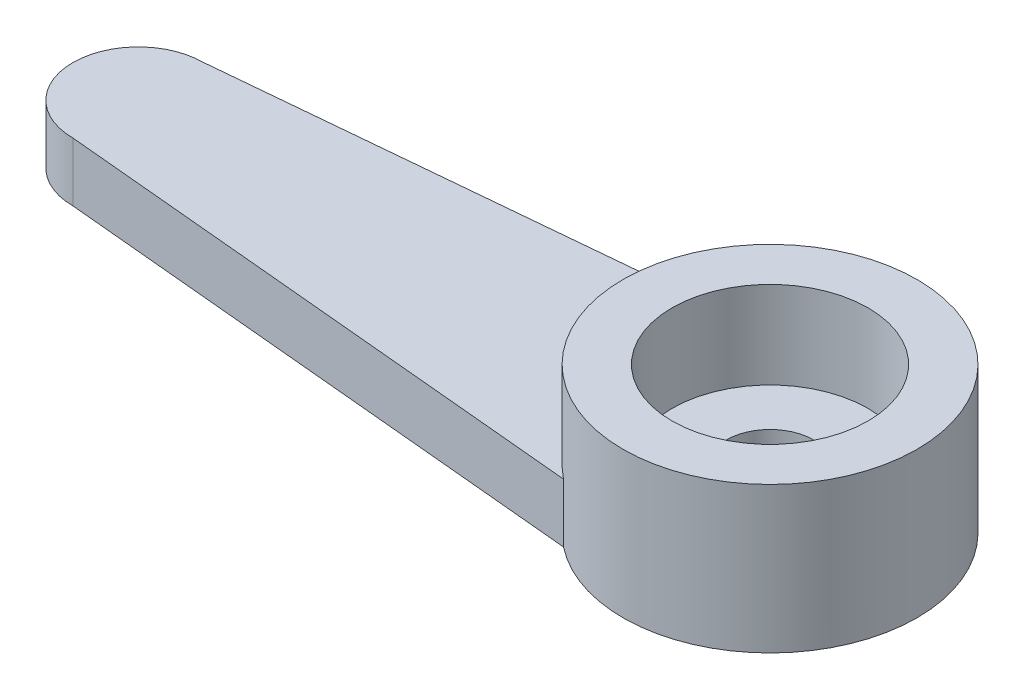
ISO-10303-21;
HEADER;
FILE_DESCRIPTION(('STEP AP214'),'2;1');
FILE_NAME('part.step','',(''),(''),'','','');
FILE_SCHEMA(('AUTOMOTIVE_DESIGN { 1 0 10303 214 1 1 1 1 }'));
ENDSEC;
DATA;
#1=APPLICATION_CONTEXT('core data for automotive mechanical design processes');
#2=APPLICATION_PROTOCOL_DEFINITION('international standard','automotive_design',2000,#1);
#3=PRODUCT_CONTEXT('',#1,'mechanical');
#4=PRODUCT('Part','Part','',(#3));
#5=PRODUCT_RELATED_PRODUCT_CATEGORY('part','',(#4));
#6=PRODUCT_DEFINITION_FORMATION('','',#4);
#7=PRODUCT_DEFINITION_CONTEXT('part definition',#1,'design');
#8=PRODUCT_DEFINITION('design','',#6,#7);
#9=PRODUCT_DEFINITION_SHAPE('','',#8);
#10=(LENGTH_UNIT() NAMED_UNIT(*) SI_UNIT(.MILLI.,.METRE.));
#11=(NAMED_UNIT(*) PLANE_ANGLE_UNIT() SI_UNIT($,.RADIAN.));
#12=(NAMED_UNIT(*) SI_UNIT($,.STERADIAN.) SOLID_ANGLE_UNIT());
#13=UNCERTAINTY_MEASURE_WITH_UNIT(LENGTH_MEASURE(1.E-05),#10,'distance_accuracy_value','');
#14=(GEOMETRIC_REPRESENTATION_CONTEXT(3) GLOBAL_UNCERTAINTY_ASSIGNED_CONTEXT((#13)) GLOBAL_UNIT_ASSIGNED_CONTEXT((#10,
#11,#12)) REPRESENTATION_CONTEXT('',''));
#15=CARTESIAN_POINT('',(0.,0.,0.));
#16=DIRECTION('',(0.,0.,1.));
#17=DIRECTION('',(1.,0.,0.));
#18=AXIS2_PLACEMENT_3D('',#15,#16,#17);
#19=CARTESIAN_POINT('',(-0.26127194813818,1.35,-2.81946375110068));
#20=DIRECTION('',(0.0922719158434675,0.,0.995733846741475));
#21=DIRECTION('',(0.995733846741475,0.,-0.0922719158434676));
#22=AXIS2_PLACEMENT_3D('',#19,#20,#21);
#23=PLANE('',#22);
#24=DIRECTION('',(-0.995733846741475,0.,0.0922719158434676));
#25=VECTOR('',#24,1.);
#26=CARTESIAN_POINT('',(-0.26127194813818,0.,-2.81946375110068));
#27=LINE('',#26,#25);
#28=CARTESIAN_POINT('',(-2.09000598085269,0.,-2.65));
#29=VERTEX_POINT('',#28);
#30=CARTESIAN_POINT('',(-14.5,0.,-1.5));
#31=VERTEX_POINT('',#30);
#32=EDGE_CURVE('E99',#29,#31,#27,.T.);
#33=ORIENTED_EDGE('',*,*,#32,.T.);
#34=DIRECTION('',(0.,-1.,0.));
#35=VECTOR('',#34,1.);
#36=CARTESIAN_POINT('',(-14.5,1.35,-1.5));
#37=LINE('',#36,#35);
#38=CARTESIAN_POINT('',(-14.5,1.35,-1.5));
#39=VERTEX_POINT('',#38);
#40=EDGE_CURVE('E11',#39,#31,#37,.T.);
#41=ORIENTED_EDGE('',*,*,#40,.F.);
#42=DIRECTION('',(-0.995733846741475,0.,0.0922719158434676));
#43=VECTOR('',#42,1.);
#44=CARTESIAN_POINT('',(-0.26127194813818,1.35,-2.81946375110068));
#45=LINE('',#44,#43);
#46=CARTESIAN_POINT('',(-2.09000598085269,1.35,-2.65));
#47=VERTEX_POINT('',#46);
#48=EDGE_CURVE('E82',#47,#39,#45,.T.);
#49=ORIENTED_EDGE('',*,*,#48,.F.);
#50=DIRECTION('',(0.,-1.,0.));
#51=VECTOR('',#50,1.);
#52=CARTESIAN_POINT('',(-2.09000598085269,1.35,-2.65));
#53=LINE('',#52,#51);
#54=EDGE_CURVE('E84',#47,#29,#53,.T.);
#55=ORIENTED_EDGE('',*,*,#54,.T.);
#56=EDGE_LOOP('',(#33,#41,#49,#55));
#57=FACE_BOUND('',#56,.T.);
#58=ADVANCED_FACE('F36',(#57),#23,.F.);
#59=CARTESIAN_POINT('',(-14.5,1.35,0.));
#60=DIRECTION('',(0.,-1.,0.));
#61=DIRECTION('',(0.,0.,-1.));
#62=AXIS2_PLACEMENT_3D('',#59,#60,#61);
#63=CYLINDRICAL_SURFACE('',#62,1.5);
#64=CARTESIAN_POINT('',(-14.5,0.,0.));
#65=DIRECTION('',(0.,1.,0.));
#66=DIRECTION('',(0.,0.,1.));
#67=AXIS2_PLACEMENT_3D('',#64,#65,#66);
#68=CIRCLE('',#67,1.5);
#69=CARTESIAN_POINT('',(-14.5,0.,1.5));
#70=VERTEX_POINT('',#69);
#71=EDGE_CURVE('E109',#31,#70,#68,.T.);
#72=ORIENTED_EDGE('',*,*,#71,.T.);
#73=DIRECTION('',(0.,-1.,0.));
#74=VECTOR('',#73,1.);
#75=CARTESIAN_POINT('',(-14.5,1.35,1.5));
#76=LINE('',#75,#74);
#77=CARTESIAN_POINT('',(-14.5,1.35,1.5));
#78=VERTEX_POINT('',#77);
#79=EDGE_CURVE('E44',#78,#70,#76,.T.);
#80=ORIENTED_EDGE('',*,*,#79,.F.);
#81=CARTESIAN_POINT('',(-14.5,1.35,0.));
#82=DIRECTION('',(0.,1.,0.));
#83=DIRECTION('',(0.,0.,1.));
#84=AXIS2_PLACEMENT_3D('',#81,#82,#83);
#85=CIRCLE('',#84,1.5);
#86=EDGE_CURVE('E76',#39,#78,#85,.T.);
#87=ORIENTED_EDGE('',*,*,#86,.F.);
#88=ORIENTED_EDGE('',*,*,#40,.T.);
#89=EDGE_LOOP('',(#72,#80,#87,#88));
#90=FACE_BOUND('',#89,.T.);
#91=ADVANCED_FACE('F117',(#90),#63,.T.);
#92=CARTESIAN_POINT('',(-0.26127194813818,1.35,2.81946375110068));
#93=DIRECTION('',(-0.0922719158434675,0.,0.995733846741475));
#94=DIRECTION('',(0.995733846741475,0.,0.0922719158434676));
#95=AXIS2_PLACEMENT_3D('',#92,#93,#94);
#96=PLANE('',#95);
#97=DIRECTION('',(-0.995733846741475,0.,-0.0922719158434676));
#98=VECTOR('',#97,1.);
#99=CARTESIAN_POINT('',(-0.26127194813818,0.,2.81946375110068));
#100=LINE('',#99,#98);
#101=CARTESIAN_POINT('',(-2.09000598085269,0.,2.65));
#102=VERTEX_POINT('',#101);
#103=EDGE_CURVE('E112',#102,#70,#100,.T.);
#104=ORIENTED_EDGE('',*,*,#103,.F.);
#105=DIRECTION('',(0.,-1.,0.));
#106=VECTOR('',#105,1.);
#107=CARTESIAN_POINT('',(-2.09000598085269,1.35,2.65));
#108=LINE('',#107,#106);
#109=CARTESIAN_POINT('',(-2.09000598085269,1.35,2.65));
#110=VERTEX_POINT('',#109);
#111=EDGE_CURVE('E52',#110,#102,#108,.T.);
#112=ORIENTED_EDGE('',*,*,#111,.F.);
#113=DIRECTION('',(-0.995733846741475,0.,-0.0922719158434676));
#114=VECTOR('',#113,1.);
#115=CARTESIAN_POINT('',(-0.26127194813818,1.35,2.81946375110068));
#116=LINE('',#115,#114);
#117=EDGE_CURVE('E92',#110,#78,#116,.T.);
#118=ORIENTED_EDGE('',*,*,#117,.T.);
#119=ORIENTED_EDGE('',*,*,#79,.T.);
#120=EDGE_LOOP('',(#104,#112,#118,#119));
#121=FACE_BOUND('',#120,.T.);
#122=ADVANCED_FACE('F116',(#121),#96,.T.);
#123=CARTESIAN_POINT('',(0.,1.35,0.));
#124=DIRECTION('',(0.,-1.,0.));
#125=DIRECTION('',(0.,0.,-1.));
#126=AXIS2_PLACEMENT_3D('',#123,#124,#125);
#127=CYLINDRICAL_SURFACE('',#126,3.375);
#128=CARTESIAN_POINT('',(0.,0.,0.));
#129=DIRECTION('',(0.,1.,0.));
#130=DIRECTION('',(0.,0.,1.));
#131=AXIS2_PLACEMENT_3D('',#128,#129,#130);
#132=CIRCLE('',#131,3.375);
#133=EDGE_CURVE('E71',#102,#29,#132,.T.);
#134=ORIENTED_EDGE('',*,*,#133,.T.);
#135=ORIENTED_EDGE('',*,*,#54,.F.);
#136=CARTESIAN_POINT('',(0.,1.35,0.));
#137=DIRECTION('',(0.,1.,0.));
#138=DIRECTION('',(0.,0.,1.));
#139=AXIS2_PLACEMENT_3D('',#136,#137,#138);
#140=CIRCLE('',#139,3.375);
#141=EDGE_CURVE('E91',#47,#110,#140,.T.);
#142=ORIENTED_EDGE('',*,*,#141,.T.);
#143=ORIENTED_EDGE('',*,*,#111,.T.);
#144=EDGE_LOOP('',(#134,#135,#142,#143));
#145=FACE_BOUND('',#144,.T.);
#146=CARTESIAN_POINT('',(0.,3.35,0.));
#147=DIRECTION('',(0.,1.,0.));
#148=DIRECTION('',(0.,0.,1.));
#149=AXIS2_PLACEMENT_3D('',#146,#147,#148);
#150=CIRCLE('',#149,3.375);
#151=CARTESIAN_POINT('',(0.,3.35,3.375));
#152=VERTEX_POINT('',#151);
#153=EDGE_CURVE('E95',#152,#152,#150,.T.);
#154=ORIENTED_EDGE('',*,*,#153,.F.);
#155=EDGE_LOOP('',(#154));
#156=FACE_BOUND('',#155,.T.);
#157=ADVANCED_FACE('F89',(#145,#156),#127,.T.);
#158=CARTESIAN_POINT('',(0.,1.35,0.));
#159=DIRECTION('',(0.,1.,0.));
#160=DIRECTION('',(0.,0.,1.));
#161=AXIS2_PLACEMENT_3D('',#158,#159,#160);
#162=PLANE('',#161);
#163=ORIENTED_EDGE('',*,*,#141,.F.);
#164=ORIENTED_EDGE('',*,*,#48,.T.);
#165=ORIENTED_EDGE('',*,*,#86,.T.);
#166=ORIENTED_EDGE('',*,*,#117,.F.);
#167=EDGE_LOOP('',(#163,#164,#165,#166));
#168=FACE_BOUND('',#167,.T.);
#169=ADVANCED_FACE('F94',(#168),#162,.T.);
#170=CARTESIAN_POINT('',(0.,0.,0.));
#171=DIRECTION('',(0.,1.,0.));
#172=DIRECTION('',(0.,0.,1.));
#173=AXIS2_PLACEMENT_3D('',#170,#171,#172);
#174=PLANE('',#173);
#175=CARTESIAN_POINT('',(0.,0.,0.));
#176=DIRECTION('',(0.,1.,0.));
#177=DIRECTION('',(0.,0.,1.));
#178=AXIS2_PLACEMENT_3D('',#175,#176,#177);
#179=CIRCLE('',#178,1.);
#180=CARTESIAN_POINT('',(0.,0.,1.));
#181=VERTEX_POINT('',#180);
#182=EDGE_CURVE('E198',#181,#181,#179,.T.);
#183=ORIENTED_EDGE('',*,*,#182,.T.);
#184=EDGE_LOOP('',(#183));
#185=FACE_BOUND('',#184,.T.);
#186=ORIENTED_EDGE('',*,*,#32,.F.);
#187=ORIENTED_EDGE('',*,*,#133,.F.);
#188=ORIENTED_EDGE('',*,*,#103,.T.);
#189=ORIENTED_EDGE('',*,*,#71,.F.);
#190=EDGE_LOOP('',(#186,#187,#188,#189));
#191=FACE_BOUND('',#190,.T.);
#192=ADVANCED_FACE('F119',(#185,#191),#174,.F.);
#193=CARTESIAN_POINT('',(0.,3.35,0.));
#194=DIRECTION('',(0.,1.,0.));
#195=DIRECTION('',(0.,0.,1.));
#196=AXIS2_PLACEMENT_3D('',#193,#194,#195);
#197=PLANE('',#196);
#198=CARTESIAN_POINT('',(0.,3.35,0.));
#199=DIRECTION('',(0.,1.,0.));
#200=DIRECTION('',(0.,0.,1.));
#201=AXIS2_PLACEMENT_3D('',#198,#199,#200);
#202=CIRCLE('',#201,2.25);
#203=CARTESIAN_POINT('',(0.,3.35,2.25));
#204=VERTEX_POINT('',#203);
#205=EDGE_CURVE('E102',#204,#204,#202,.T.);
#206=ORIENTED_EDGE('',*,*,#205,.F.);
#207=EDGE_LOOP('',(#206));
#208=FACE_BOUND('',#207,.T.);
#209=ORIENTED_EDGE('',*,*,#153,.T.);
#210=EDGE_LOOP('',(#209));
#211=FACE_BOUND('',#210,.T.);
#212=ADVANCED_FACE('F121',(#208,#211),#197,.T.);
#213=CARTESIAN_POINT('',(0.,1.35,0.));
#214=DIRECTION('',(0.,1.,0.));
#215=DIRECTION('',(0.,0.,1.));
#216=AXIS2_PLACEMENT_3D('',#213,#214,#215);
#217=CYLINDRICAL_SURFACE('',#216,2.25);
#218=CARTESIAN_POINT('',(0.,1.35,0.));
#219=DIRECTION('',(0.,1.,0.));
#220=DIRECTION('',(0.,0.,1.));
#221=AXIS2_PLACEMENT_3D('',#218,#219,#220);
#222=CIRCLE('',#221,2.25);
#223=CARTESIAN_POINT('',(0.,1.35,2.25));
#224=VERTEX_POINT('',#223);
#225=EDGE_CURVE('E96',#224,#224,#222,.T.);
#226=ORIENTED_EDGE('',*,*,#225,.F.);
#227=EDGE_LOOP('',(#226));
#228=FACE_BOUND('',#227,.T.);
#229=ORIENTED_EDGE('',*,*,#205,.T.);
#230=EDGE_LOOP('',(#229));
#231=FACE_BOUND('',#230,.T.);
#232=ADVANCED_FACE('F128',(#228,#231),#217,.F.);
#233=CARTESIAN_POINT('',(0.,1.35,0.));
#234=DIRECTION('',(0.,1.,0.));
#235=DIRECTION('',(0.,0.,1.));
#236=AXIS2_PLACEMENT_3D('',#233,#234,#235);
#237=PLANE('',#236);
#238=CARTESIAN_POINT('',(0.,1.35,0.));
#239=DIRECTION('',(0.,1.,0.));
#240=DIRECTION('',(0.,0.,1.));
#241=AXIS2_PLACEMENT_3D('',#238,#239,#240);
#242=CIRCLE('',#241,1.);
#243=CARTESIAN_POINT('',(0.,1.35,1.));
#244=VERTEX_POINT('',#243);
#245=EDGE_CURVE('E201',#244,#244,#242,.T.);
#246=ORIENTED_EDGE('',*,*,#245,.F.);
#247=EDGE_LOOP('',(#246));
#248=FACE_BOUND('',#247,.T.);
#249=ORIENTED_EDGE('',*,*,#225,.T.);
#250=EDGE_LOOP('',(#249));
#251=FACE_BOUND('',#250,.T.);
#252=ADVANCED_FACE('F167',(#248,#251),#237,.T.);
#253=CARTESIAN_POINT('',(0.,0.,0.));
#254=DIRECTION('',(0.,1.,0.));
#255=DIRECTION('',(0.,0.,1.));
#256=AXIS2_PLACEMENT_3D('',#253,#254,#255);
#257=CYLINDRICAL_SURFACE('',#256,1.);
#258=CARTESIAN_POINT('',(0.,0.,1.));
#259=CARTESIAN_POINT('',(0.,0.0140625,1.));
#260=CARTESIAN_POINT('',(0.,0.028125,1.));
#261=CARTESIAN_POINT('',(0.,0.05625,1.));
#262=CARTESIAN_POINT('',(0.,0.0703125,1.));
#263=CARTESIAN_POINT('',(0.,0.0984375,1.));
#264=CARTESIAN_POINT('',(0.,0.1125,1.));
#265=CARTESIAN_POINT('',(0.,0.140625,1.));
#266=CARTESIAN_POINT('',(0.,0.1546875,1.));
#267=CARTESIAN_POINT('',(0.,0.1828125,1.));
#268=CARTESIAN_POINT('',(0.,0.196875,1.));
#269=CARTESIAN_POINT('',(0.,0.225,1.));
#270=CARTESIAN_POINT('',(0.,0.2390625,1.));
#271=CARTESIAN_POINT('',(0.,0.2671875,1.));
#272=CARTESIAN_POINT('',(0.,0.28125,1.));
#273=CARTESIAN_POINT('',(0.,0.309375,1.));
#274=CARTESIAN_POINT('',(0.,0.3234375,1.));
#275=CARTESIAN_POINT('',(0.,0.3515625,1.));
#276=CARTESIAN_POINT('',(0.,0.365625,1.));
#277=CARTESIAN_POINT('',(0.,0.39375,1.));
#278=CARTESIAN_POINT('',(0.,0.4078125,1.));
#279=CARTESIAN_POINT('',(0.,0.4359375,1.));
#280=CARTESIAN_POINT('',(0.,0.45,1.));
#281=CARTESIAN_POINT('',(0.,0.478125,1.));
#282=CARTESIAN_POINT('',(0.,0.4921875,1.));
#283=CARTESIAN_POINT('',(0.,0.5203125,1.));
#284=CARTESIAN_POINT('',(0.,0.534375,1.));
#285=CARTESIAN_POINT('',(0.,0.5625,1.));
#286=CARTESIAN_POINT('',(0.,0.5765625,1.));
#287=CARTESIAN_POINT('',(0.,0.6046875,1.));
#288=CARTESIAN_POINT('',(0.,0.61875,1.));
#289=CARTESIAN_POINT('',(0.,0.646875,1.));
#290=CARTESIAN_POINT('',(0.,0.6609375,1.));
#291=CARTESIAN_POINT('',(0.,0.6890625,1.));
#292=CARTESIAN_POINT('',(0.,0.703125,1.));
#293=CARTESIAN_POINT('',(0.,0.73125,1.));
#294=CARTESIAN_POINT('',(0.,0.7453125,1.));
#295=CARTESIAN_POINT('',(0.,0.7734375,1.));
#296=CARTESIAN_POINT('',(0.,0.7875,1.));
#297=CARTESIAN_POINT('',(0.,0.815625,1.));
#298=CARTESIAN_POINT('',(0.,0.8296875,1.));
#299=CARTESIAN_POINT('',(0.,0.8578125,1.));
#300=CARTESIAN_POINT('',(0.,0.871875,1.));
#301=CARTESIAN_POINT('',(0.,0.9,1.));
#302=CARTESIAN_POINT('',(0.,0.9140625,1.));
#303=CARTESIAN_POINT('',(0.,0.9421875,1.));
#304=CARTESIAN_POINT('',(0.,0.95625,1.));
#305=CARTESIAN_POINT('',(0.,0.984375,1.));
#306=CARTESIAN_POINT('',(0.,0.9984375,1.));
#307=CARTESIAN_POINT('',(0.,1.0265625,1.));
#308=CARTESIAN_POINT('',(0.,1.040625,1.));
#309=CARTESIAN_POINT('',(0.,1.06875,1.));
#310=CARTESIAN_POINT('',(0.,1.0828125,1.));
#311=CARTESIAN_POINT('',(0.,1.1109375,1.));
#312=CARTESIAN_POINT('',(0.,1.125,1.));
#313=CARTESIAN_POINT('',(0.,1.153125,1.));
#314=CARTESIAN_POINT('',(0.,1.1671875,1.));
#315=CARTESIAN_POINT('',(0.,1.1953125,1.));
#316=CARTESIAN_POINT('',(0.,1.209375,1.));
#317=CARTESIAN_POINT('',(0.,1.2375,1.));
#318=CARTESIAN_POINT('',(0.,1.2515625,1.));
#319=CARTESIAN_POINT('',(0.,1.2796875,1.));
#320=CARTESIAN_POINT('',(0.,1.29375,1.));
#321=CARTESIAN_POINT('',(0.,1.321875,1.));
#322=CARTESIAN_POINT('',(0.,1.3359375,1.));
#323=CARTESIAN_POINT('',(0.,1.35,1.));
#324=B_SPLINE_CURVE_WITH_KNOTS('',3,(#258,#259,#260,#261,#262,#263,#264,#265,#266,#267,#268,
#269,#270,#271,#272,#273,#274,#275,#276,#277,#278,#279,#280,#281,#282,#283,#284,#285,#286,#287,
#288,#289,#290,#291,#292,#293,#294,#295,#296,#297,#298,#299,#300,#301,#302,#303,#304,#305,#306,
#307,#308,#309,#310,#311,#312,#313,#314,#315,#316,#317,#318,#319,#320,#321,#322,#323),
.UNSPECIFIED.,.F.,.F.,(4,2,2,2,2,2,2,2,2,2,2,2,2,2,2,2,2,2,2,2,2,2,2,2,2,2,2,2,2,2,2,2,4),(0.,
0.0421875,0.084375,0.1265625,0.16875,0.2109375,0.253125,0.2953125,0.3375,0.3796875,0.421875,
0.4640625,0.50625,0.5484375,0.590625,0.6328125,0.675,0.7171875,0.759375,0.8015625,0.84375,
0.8859375,0.928125,0.9703125,1.0125,1.0546875,1.096875,1.1390625,1.18125,1.2234375,1.265625,
1.3078125,1.35),.UNSPECIFIED.);
#325=EDGE_CURVE('BSEAM182',#181,#244,#324,.T.);
#326=ORIENTED_EDGE('',*,*,#182,.F.);
#327=ORIENTED_EDGE('',*,*,#245,.T.);
#328=ORIENTED_EDGE('',*,*,#325,.T.);
#329=ORIENTED_EDGE('',*,*,#325,.F.);
#330=EDGE_LOOP('',(#326,#328,#327,#329));
#331=FACE_BOUND('',#330,.T.);
#332=ADVANCED_FACE('F182',(#331),#257,.F.);
#333=CLOSED_SHELL('',(#58,#91,#122,#157,#169,#192,#212,#232,#252,#332));
#334=MANIFOLD_SOLID_BREP('B2',#333);
#335=ADVANCED_BREP_SHAPE_REPRESENTATION('',(#18,#334),#14);
#336=SHAPE_DEFINITION_REPRESENTATION(#9,#335);
ENDSEC;
END-ISO-10303-21;
